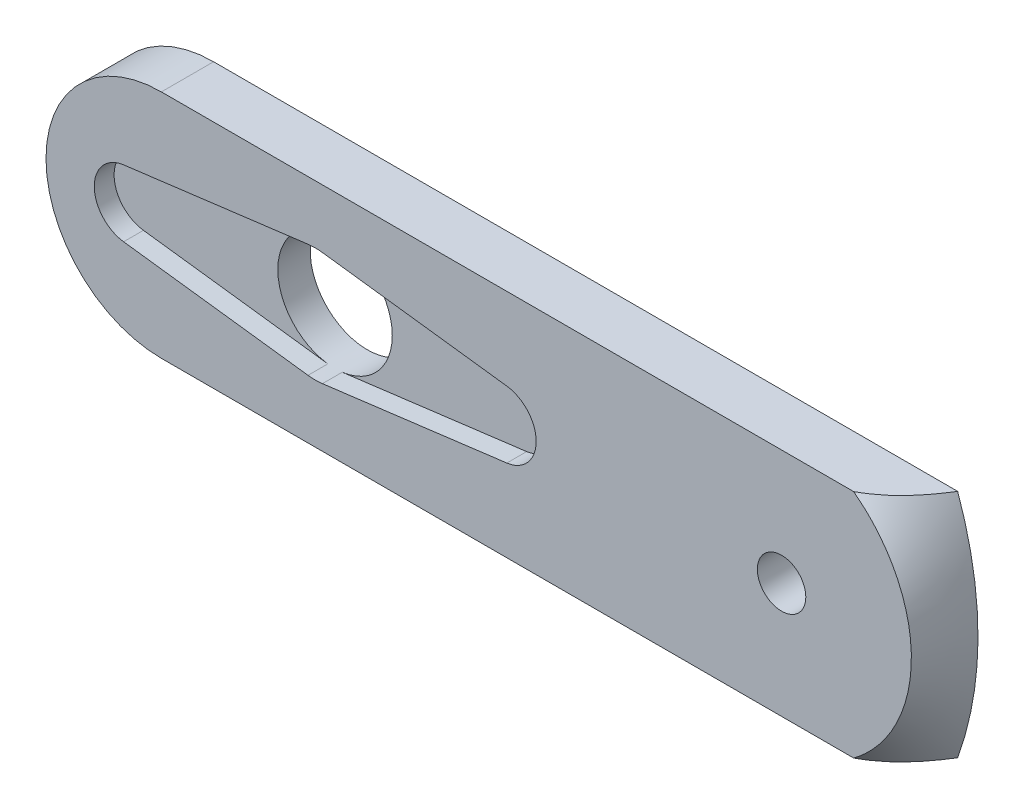
ISO-10303-21;
HEADER;
FILE_DESCRIPTION(('STEP AP214'),'2;1');
FILE_NAME('part.step','',(''),(''),'','','');
FILE_SCHEMA(('AUTOMOTIVE_DESIGN { 1 0 10303 214 1 1 1 1 }'));
ENDSEC;
DATA;
#1=APPLICATION_CONTEXT('core data for automotive mechanical design processes');
#2=APPLICATION_PROTOCOL_DEFINITION('international standard','automotive_design',2000,#1);
#3=PRODUCT_CONTEXT('',#1,'mechanical');
#4=PRODUCT('Part','Part','',(#3));
#5=PRODUCT_RELATED_PRODUCT_CATEGORY('part','',(#4));
#6=PRODUCT_DEFINITION_FORMATION('','',#4);
#7=PRODUCT_DEFINITION_CONTEXT('part definition',#1,'design');
#8=PRODUCT_DEFINITION('design','',#6,#7);
#9=PRODUCT_DEFINITION_SHAPE('','',#8);
#10=(LENGTH_UNIT() NAMED_UNIT(*) SI_UNIT(.MILLI.,.METRE.));
#11=(NAMED_UNIT(*) PLANE_ANGLE_UNIT() SI_UNIT($,.RADIAN.));
#12=(NAMED_UNIT(*) SI_UNIT($,.STERADIAN.) SOLID_ANGLE_UNIT());
#13=UNCERTAINTY_MEASURE_WITH_UNIT(LENGTH_MEASURE(1.E-05),#10,'distance_accuracy_value','');
#14=(GEOMETRIC_REPRESENTATION_CONTEXT(3) GLOBAL_UNCERTAINTY_ASSIGNED_CONTEXT((#13)) GLOBAL_UNIT_ASSIGNED_CONTEXT((#10,
#11,#12)) REPRESENTATION_CONTEXT('',''));
#15=CARTESIAN_POINT('',(0.,0.,0.));
#16=DIRECTION('',(0.,0.,1.));
#17=DIRECTION('',(1.,0.,0.));
#18=AXIS2_PLACEMENT_3D('',#15,#16,#17);
#19=CARTESIAN_POINT('',(-15.875,36.275,12.915050116));
#20=DIRECTION('',(0.,1.,0.));
#21=DIRECTION('',(-1.,0.,0.));
#22=AXIS2_PLACEMENT_3D('',#19,#20,#21);
#23=PLANE('',#22);
#24=CARTESIAN_POINT('',(4.27479089331014,36.275,12.9150501160211));
#25=CARTESIAN_POINT('',(4.18794333084375,36.275,13.0553004026635));
#26=CARTESIAN_POINT('',(4.09939031178845,36.275,13.1945099637529));
#27=CARTESIAN_POINT('',(3.91830719572066,36.275,13.4708936781452));
#28=CARTESIAN_POINT('',(3.82576629708334,36.275,13.6080607474796));
#29=CARTESIAN_POINT('',(3.6364964954175,36.275,13.879795856272));
#30=CARTESIAN_POINT('',(3.5397613652383,36.275,14.0143595701682));
#31=CARTESIAN_POINT('',(3.34187656697785,36.275,14.2803025558375));
#32=CARTESIAN_POINT('',(3.24072492356059,36.275,14.4116803609584));
#33=CARTESIAN_POINT('',(3.03626626662407,36.275,14.6675355060892));
#34=CARTESIAN_POINT('',(2.93307231560844,36.275,14.7921030174213));
#35=CARTESIAN_POINT('',(2.72203957971217,36.275,15.0370948179405));
#36=CARTESIAN_POINT('',(2.61420414651549,36.275,15.1575219875372));
#37=CARTESIAN_POINT('',(2.39368080130622,36.275,15.3936902474856));
#38=CARTESIAN_POINT('',(2.28099654123386,36.275,15.5094347414385));
#39=CARTESIAN_POINT('',(2.0505740421931,36.275,15.7357082233837));
#40=CARTESIAN_POINT('',(1.93283769001432,36.275,15.8462391266568));
#41=CARTESIAN_POINT('',(1.72127304127678,36.275,16.0355114203854));
#42=CARTESIAN_POINT('',(1.62854156515779,36.275,16.1154809673195));
#43=CARTESIAN_POINT('',(1.44009890250969,36.275,16.2718460275529));
#44=CARTESIAN_POINT('',(1.34438755212391,36.275,16.348241343733));
#45=CARTESIAN_POINT('',(1.15003391793479,36.275,16.4971978447037));
#46=CARTESIAN_POINT('',(1.05139181521655,36.275,16.5697592656162));
#47=CARTESIAN_POINT('',(0.849860144381622,36.275,16.7118008009865));
#48=CARTESIAN_POINT('',(0.746930685601863,36.275,16.7812243706619));
#49=CARTESIAN_POINT('',(0.538232373857244,36.275,16.9156959496909));
#50=CARTESIAN_POINT('',(0.432463166342112,36.275,16.9807434090877));
#51=CARTESIAN_POINT('',(0.218214523256502,36.275,17.1063148268337));
#52=CARTESIAN_POINT('',(0.109733985363282,36.275,17.1668369040678));
#53=CARTESIAN_POINT('',(0.,36.275,17.225000094));
#54=B_SPLINE_CURVE_WITH_KNOTS('',3,(#24,#25,#26,#27,#28,#29,#30,#31,#32,#33,#34,#35,#36,#37,#38,
#39,#40,#41,#42,#43,#44,#45,#46,#47,#48,#49,#50,#51,#52,#53),.UNSPECIFIED.,.F.,.F.,(4,2,2,2,2,2,
2,2,2,2,2,2,2,2,4),(0.,0.494895000724621,0.991227030351283,1.48832304174992,1.98564370932828,
2.47081224117761,2.95563611788026,3.44010102611087,3.92438655115526,4.29165885820719,
4.65895139654019,5.02622128763424,5.39857424309917,5.77097390602647,6.14352751760772),.UNSPECIFIED.);
#55=CARTESIAN_POINT('',(4.27479089326775,36.2750000001558,12.915050116));
#56=VERTEX_POINT('',#55);
#57=CARTESIAN_POINT('',(0.,36.275,17.225000094));
#58=VERTEX_POINT('',#57);
#59=EDGE_CURVE('E152',#56,#58,#54,.T.);
#60=ORIENTED_EDGE('',*,*,#59,.F.);
#61=DIRECTION('',(1.,0.,0.));
#62=VECTOR('',#61,1.);
#63=CARTESIAN_POINT('',(-57.15,36.275,12.915050116));
#64=LINE('',#63,#62);
#65=CARTESIAN_POINT('',(-57.15,36.275,12.915050116));
#66=VERTEX_POINT('',#65);
#67=EDGE_CURVE('E142',#66,#56,#64,.T.);
#68=ORIENTED_EDGE('',*,*,#67,.F.);
#69=DIRECTION('',(0.,0.,1.));
#70=VECTOR('',#69,1.);
#71=CARTESIAN_POINT('',(-57.15,36.275,-18.738253535905));
#72=LINE('',#71,#70);
#73=CARTESIAN_POINT('',(-57.15,36.275,17.225000094));
#74=VERTEX_POINT('',#73);
#75=EDGE_CURVE('E229',#66,#74,#72,.T.);
#76=ORIENTED_EDGE('',*,*,#75,.T.);
#77=DIRECTION('',(-1.,0.,0.));
#78=VECTOR('',#77,1.);
#79=CARTESIAN_POINT('',(0.,36.275,17.225000094));
#80=LINE('',#79,#78);
#81=CARTESIAN_POINT('',(-9.52500000000001,36.275,17.225000094));
#82=VERTEX_POINT('',#81);
#83=EDGE_CURVE('E226',#82,#74,#80,.T.);
#84=ORIENTED_EDGE('',*,*,#83,.F.);
#85=CARTESIAN_POINT('',(0.,36.275,17.225000094));
#86=DIRECTION('',(-1.,0.,0.));
#87=VECTOR('',#86,1.);
#88=LINE('',#85,#87);
#89=EDGE_CURVE('E214',#58,#82,#88,.T.);
#90=ORIENTED_EDGE('',*,*,#89,.F.);
#91=EDGE_LOOP('',(#60,#68,#76,#84,#90));
#92=FACE_BOUND('',#91,.T.);
#93=ADVANCED_FACE('F36',(#92),#23,.T.);
#94=CARTESIAN_POINT('',(-57.15,17.225,17.225000094));
#95=DIRECTION('',(0.,-1.,0.));
#96=DIRECTION('',(1.,0.,0.));
#97=AXIS2_PLACEMENT_3D('',#94,#95,#96);
#98=PLANE('',#97);
#99=CARTESIAN_POINT('',(0.,17.225,17.225000094));
#100=CARTESIAN_POINT('',(0.136688693030192,17.225,17.1525621570837));
#101=CARTESIAN_POINT('',(0.271422304674454,17.225,17.0764523098915));
#102=CARTESIAN_POINT('',(0.536369299326438,17.225,16.9174233608304));
#103=CARTESIAN_POINT('',(0.666592786898193,17.225,16.8345210990087));
#104=CARTESIAN_POINT('',(0.922410663568643,17.225,16.6621973888533));
#105=CARTESIAN_POINT('',(1.04801063418056,17.225,16.5727842168717));
#106=CARTESIAN_POINT('',(1.29454050957519,17.225,16.3878212164848));
#107=CARTESIAN_POINT('',(1.41547185860477,17.225,16.2922733106282));
#108=CARTESIAN_POINT('',(1.65036007235586,17.225,16.0973839823706));
#109=CARTESIAN_POINT('',(1.7644059653232,17.225,15.9981496601951));
#110=CARTESIAN_POINT('',(1.98801762157755,17.225,15.794672746648));
#111=CARTESIAN_POINT('',(2.09758150876102,17.225,15.6904280969415));
#112=CARTESIAN_POINT('',(2.3122907176054,17.225,15.4774301008489));
#113=CARTESIAN_POINT('',(2.41743472551892,17.225,15.3686754327394));
#114=CARTESIAN_POINT('',(2.62339356614884,17.225,15.1471823200141));
#115=CARTESIAN_POINT('',(2.72420912703865,17.225,15.0344445513375));
#116=CARTESIAN_POINT('',(2.91228200384608,17.225,14.8163522107272));
#117=CARTESIAN_POINT('',(2.99991476180945,17.225,14.7113205097096));
#118=CARTESIAN_POINT('',(3.17193041769378,17.225,14.4986894905132));
#119=CARTESIAN_POINT('',(3.25631438368281,17.225,14.391091035347));
#120=CARTESIAN_POINT('',(3.42203220915207,17.225,14.173580824842));
#121=CARTESIAN_POINT('',(3.50336618616677,17.225,14.0636691589005));
#122=CARTESIAN_POINT('',(3.66425752967562,17.225,13.8402614866942));
#123=CARTESIAN_POINT('',(3.74377531095845,17.225,13.7267370071403));
#124=CARTESIAN_POINT('',(3.90004503044904,17.225,13.4978029340737));
#125=CARTESIAN_POINT('',(3.97679695488933,17.225,13.3823933311817));
#126=CARTESIAN_POINT('',(4.12769714002857,17.225,13.1499183268782));
#127=CARTESIAN_POINT('',(4.20184595501919,17.225,13.0328532855057));
#128=CARTESIAN_POINT('',(4.27479089919016,17.225,12.9150501160211));
#129=B_SPLINE_CURVE_WITH_KNOTS('',3,(#99,#100,#101,#102,#103,#104,#105,#106,#107,#108,#109,#110,
#111,#112,#113,#114,#115,#116,#117,#118,#119,#120,#121,#122,#123,#124,#125,#126,#127,#128),
.UNSPECIFIED.,.F.,.F.,(4,2,2,2,2,2,2,2,2,2,2,2,2,2,4),(0.,0.464022611801142,0.926927725128426,
1.38925435611067,1.85143680031478,2.30480477624924,2.75836062321493,3.21205034359092,
3.66566343839409,4.07596387073878,4.48612824097206,4.89627678882001,5.31204233094882,
5.7278099423274,6.14348847874914),.UNSPECIFIED.);
#130=CARTESIAN_POINT('',(0.,17.225,17.225000094));
#131=VERTEX_POINT('',#130);
#132=CARTESIAN_POINT('',(4.27479089919015,17.225,12.9150501160211));
#133=VERTEX_POINT('',#132);
#134=EDGE_CURVE('E137',#131,#133,#129,.T.);
#135=ORIENTED_EDGE('',*,*,#134,.F.);
#136=CARTESIAN_POINT('',(-9.52500000000001,17.225,17.225000094));
#137=DIRECTION('',(1.,0.,0.));
#138=VECTOR('',#137,1.);
#139=LINE('',#136,#138);
#140=CARTESIAN_POINT('',(-9.525,17.225,17.225000094));
#141=VERTEX_POINT('',#140);
#142=EDGE_CURVE('E217',#141,#131,#139,.T.);
#143=ORIENTED_EDGE('',*,*,#142,.F.);
#144=DIRECTION('',(1.,0.,0.));
#145=VECTOR('',#144,1.);
#146=CARTESIAN_POINT('',(0.,17.225,17.225000094));
#147=LINE('',#146,#145);
#148=CARTESIAN_POINT('',(-57.15,17.225,17.225000094));
#149=VERTEX_POINT('',#148);
#150=EDGE_CURVE('E219',#149,#141,#147,.T.);
#151=ORIENTED_EDGE('',*,*,#150,.F.);
#152=DIRECTION('',(0.,0.,1.));
#153=VECTOR('',#152,1.);
#154=CARTESIAN_POINT('',(-57.15,17.225,-18.738253535905));
#155=LINE('',#154,#153);
#156=CARTESIAN_POINT('',(-57.15,17.225,12.915050116));
#157=VERTEX_POINT('',#156);
#158=EDGE_CURVE('E140',#157,#149,#155,.T.);
#159=ORIENTED_EDGE('',*,*,#158,.F.);
#160=DIRECTION('',(-1.,0.,0.));
#161=VECTOR('',#160,1.);
#162=CARTESIAN_POINT('',(-57.15,17.225,12.915050116));
#163=LINE('',#162,#161);
#164=EDGE_CURVE('E56',#133,#157,#163,.T.);
#165=ORIENTED_EDGE('',*,*,#164,.F.);
#166=EDGE_LOOP('',(#135,#143,#151,#159,#165));
#167=FACE_BOUND('',#166,.T.);
#168=ADVANCED_FACE('F135',(#167),#98,.T.);
#169=CARTESIAN_POINT('',(-57.15,36.275,12.915050116));
#170=DIRECTION('',(0.,0.,-1.));
#171=DIRECTION('',(-1.,0.,0.));
#172=AXIS2_PLACEMENT_3D('',#169,#170,#171);
#173=PLANE('',#172);
#174=CARTESIAN_POINT('',(-5.95210200823162,26.7500000000779,12.915050116));
#175=DIRECTION('',(0.,0.,-1.));
#176=DIRECTION('',(-1.,0.,0.));
#177=AXIS2_PLACEMENT_3D('',#174,#175,#176);
#178=CIRCLE('',#177,2.);
#179=CARTESIAN_POINT('',(-7.95210200823162,26.7500000000779,12.915050116));
#180=VERTEX_POINT('',#179);
#181=EDGE_CURVE('E215',#180,#180,#178,.T.);
#182=ORIENTED_EDGE('',*,*,#181,.F.);
#183=EDGE_LOOP('',(#182));
#184=FACE_BOUND('',#183,.T.);
#185=CARTESIAN_POINT('',(4.27479089916163,17.2249999998832,12.915050116));
#186=CARTESIAN_POINT('',(4.41299990993948,17.6131200922984,12.915050116));
#187=CARTESIAN_POINT('',(4.54349401651454,18.0040180417642,12.915050116));
#188=CARTESIAN_POINT('',(4.78828214226387,18.7909023622219,12.915050116));
#189=CARTESIAN_POINT('',(4.9025741659085,19.1868893534662,12.915050116));
#190=CARTESIAN_POINT('',(5.11420616796396,19.9835871683499,12.915050116));
#191=CARTESIAN_POINT('',(5.21153766941409,20.3843002478996,12.915050116));
#192=CARTESIAN_POINT('',(5.38889062892549,21.1895216789333,12.915050116));
#193=CARTESIAN_POINT('',(5.46891290846686,21.5940298493546,12.915050116));
#194=CARTESIAN_POINT('',(5.60896167204657,22.3941688354375,12.915050116));
#195=CARTESIAN_POINT('',(5.66950972119727,22.7897082025009,12.915050116));
#196=CARTESIAN_POINT('',(5.77325398085823,23.583062996087,12.915050116));
#197=CARTESIAN_POINT('',(5.8164499535445,23.9808784537296,12.915050116));
#198=CARTESIAN_POINT('',(5.88558987024871,24.777876232266,12.915050116));
#199=CARTESIAN_POINT('',(5.91153928091858,25.1770580796906,12.915050116));
#200=CARTESIAN_POINT('',(5.94600376428673,25.9761744854712,12.915050116));
#201=CARTESIAN_POINT('',(5.95451907710353,26.3761090333843,12.915050116));
#202=CARTESIAN_POINT('',(5.95375375953051,27.1738579032581,12.915050116));
#203=CARTESIAN_POINT('',(5.94456644656798,27.5716723186967,12.915050116));
#204=CARTESIAN_POINT('',(5.90895706983451,28.366527783349,12.915050116));
#205=CARTESIAN_POINT('',(5.88253480746004,28.7635688235981,12.915050116));
#206=CARTESIAN_POINT('',(5.81262934974388,29.5562716731528,12.915050116));
#207=CARTESIAN_POINT('',(5.76914091089193,29.9519330208238,12.915050116));
#208=CARTESIAN_POINT('',(5.66499579758311,30.7409829032863,12.915050116));
#209=CARTESIAN_POINT('',(5.6043393429044,31.1343714671072,12.915050116));
#210=CARTESIAN_POINT('',(5.46427806168487,31.9300983707612,12.915050116));
#211=CARTESIAN_POINT('',(5.38436040775598,32.3323462878501,12.915050116));
#212=CARTESIAN_POINT('',(5.20740938111902,33.1330767189629,12.915050116));
#213=CARTESIAN_POINT('',(5.11037521527569,33.5315590575977,12.915050116));
#214=CARTESIAN_POINT('',(4.89952585959028,34.323841929247,12.915050116));
#215=CARTESIAN_POINT('',(4.78571890769332,34.7176446586224,12.915050116));
#216=CARTESIAN_POINT('',(4.54208018950583,35.5002135159143,12.915050116));
#217=CARTESIAN_POINT('',(4.41225035821075,35.8889802457476,12.915050116));
#218=CARTESIAN_POINT('',(4.27479089326775,36.2750000001558,12.915050116));
#219=B_SPLINE_CURVE_WITH_KNOTS('',3,(#185,#186,#187,#188,#189,#190,#191,#192,#193,#194,#195,
#196,#197,#198,#199,#200,#201,#202,#203,#204,#205,#206,#207,#208,#209,#210,#211,#212,#213,#214,
#215,#216,#217,#218),.UNSPECIFIED.,.F.,.F.,(4,2,2,2,2,2,2,2,2,2,2,2,2,2,2,2,4),(0.,
1.23594388129098,2.47203985560594,3.7087518763194,4.94540519090868,6.14546962283999,
7.34555050204564,8.5452508093305,9.74493459312245,10.9383116742609,12.1317025072884,
13.3254602920169,14.5192027954197,15.7491505331369,16.9791552784549,18.2085579084991,
19.4378122153299),.UNSPECIFIED.);
#220=EDGE_CURVE('E145',#133,#56,#219,.T.);
#221=ORIENTED_EDGE('',*,*,#220,.F.);
#222=ORIENTED_EDGE('',*,*,#164,.T.);
#223=CARTESIAN_POINT('',(-57.15,26.75,12.915050116));
#224=DIRECTION('',(0.,0.,-1.));
#225=DIRECTION('',(1.,0.,0.));
#226=AXIS2_PLACEMENT_3D('',#223,#224,#225);
#227=CIRCLE('',#226,9.525);
#228=EDGE_CURVE('E157',#157,#66,#227,.T.);
#229=ORIENTED_EDGE('',*,*,#228,.T.);
#230=ORIENTED_EDGE('',*,*,#67,.T.);
#231=EDGE_LOOP('',(#221,#222,#229,#230));
#232=FACE_BOUND('',#231,.T.);
#233=CARTESIAN_POINT('',(-44.45,26.75,12.915050116));
#234=DIRECTION('',(0.,0.,1.));
#235=DIRECTION('',(1.,0.,0.));
#236=AXIS2_PLACEMENT_3D('',#233,#234,#235);
#237=CIRCLE('',#236,4.723765);
#238=CARTESIAN_POINT('',(-39.726235,26.75,12.915050116));
#239=VERTEX_POINT('',#238);
#240=EDGE_CURVE('E141',#239,#239,#237,.F.);
#241=ORIENTED_EDGE('',*,*,#240,.F.);
#242=EDGE_LOOP('',(#241));
#243=FACE_BOUND('',#242,.T.);
#244=ADVANCED_FACE('F146',(#184,#232,#243),#173,.T.);
#245=CARTESIAN_POINT('',(-44.45,26.75,17.225000094));
#246=DIRECTION('',(0.,0.,-1.));
#247=DIRECTION('',(-1.,0.,0.));
#248=AXIS2_PLACEMENT_3D('',#245,#246,#247);
#249=PLANE('',#248);
#250=CARTESIAN_POINT('',(-5.95210200823162,26.7500000000779,17.225000094));
#251=DIRECTION('',(0.,0.,1.));
#252=DIRECTION('',(1.,0.,0.));
#253=AXIS2_PLACEMENT_3D('',#250,#251,#252);
#254=CIRCLE('',#253,2.);
#255=CARTESIAN_POINT('',(-3.95210200823162,26.7500000000779,17.225000094));
#256=VERTEX_POINT('',#255);
#257=EDGE_CURVE('E321',#256,#256,#254,.T.);
#258=ORIENTED_EDGE('',*,*,#257,.F.);
#259=EDGE_LOOP('',(#258));
#260=FACE_BOUND('',#259,.T.);
#261=DIRECTION('',(0.992003089277266,-0.126213592233009,0.));
#262=VECTOR('',#261,1.);
#263=CARTESIAN_POINT('',(-43.8537966504854,31.4359894730198,17.225000094));
#264=LINE('',#263,#262);
#265=CARTESIAN_POINT('',(-43.8537966504854,31.4359894730198,17.225000094));
#266=VERTEX_POINT('',#265);
#267=CARTESIAN_POINT('',(-28.6319218932039,29.4992944018007,17.225000094));
#268=VERTEX_POINT('',#267);
#269=EDGE_CURVE('E48',#266,#268,#264,.T.);
#270=ORIENTED_EDGE('',*,*,#269,.T.);
#271=CARTESIAN_POINT('',(-28.9817175,26.75,17.225000094));
#272=DIRECTION('',(0.,0.,-1.));
#273=DIRECTION('',(-1.,0.,0.));
#274=AXIS2_PLACEMENT_3D('',#271,#272,#273);
#275=CIRCLE('',#274,2.7714575);
#276=CARTESIAN_POINT('',(-28.6319218932039,24.0007055981994,17.225000094));
#277=VERTEX_POINT('',#276);
#278=EDGE_CURVE('E11',#268,#277,#275,.T.);
#279=ORIENTED_EDGE('',*,*,#278,.T.);
#280=DIRECTION('',(-0.992003089277266,-0.126213592233011,0.));
#281=VECTOR('',#280,1.);
#282=CARTESIAN_POINT('',(-43.8537966504854,22.0640105269802,17.225000094));
#283=LINE('',#282,#281);
#284=CARTESIAN_POINT('',(-43.8537966504854,22.0640105269802,17.225000094));
#285=VERTEX_POINT('',#284);
#286=EDGE_CURVE('E298',#277,#285,#283,.T.);
#287=ORIENTED_EDGE('',*,*,#286,.T.);
#288=CARTESIAN_POINT('',(-44.45,26.75,17.225000094));
#289=DIRECTION('',(0.,0.,-1.));
#290=DIRECTION('',(-1.,0.,0.));
#291=AXIS2_PLACEMENT_3D('',#288,#289,#290);
#292=CIRCLE('',#291,4.723765);
#293=CARTESIAN_POINT('',(-45.0462033495146,22.0640105269802,17.225000094));
#294=VERTEX_POINT('',#293);
#295=EDGE_CURVE('E292',#285,#294,#292,.T.);
#296=ORIENTED_EDGE('',*,*,#295,.T.);
#297=DIRECTION('',(-0.992003089277266,0.126213592233009,0.));
#298=VECTOR('',#297,1.);
#299=CARTESIAN_POINT('',(-45.0462033495146,22.0640105269802,17.225000094));
#300=LINE('',#299,#298);
#301=CARTESIAN_POINT('',(-60.2680781067961,24.0007055981993,17.225000094));
#302=VERTEX_POINT('',#301);
#303=EDGE_CURVE('E376',#294,#302,#300,.T.);
#304=ORIENTED_EDGE('',*,*,#303,.T.);
#305=CARTESIAN_POINT('',(-59.9182825,26.75,17.225000094));
#306=DIRECTION('',(0.,0.,-1.));
#307=DIRECTION('',(-1.,0.,0.));
#308=AXIS2_PLACEMENT_3D('',#305,#306,#307);
#309=CIRCLE('',#308,2.7714575);
#310=CARTESIAN_POINT('',(-60.2680781067961,29.4992944018006,17.225000094));
#311=VERTEX_POINT('',#310);
#312=EDGE_CURVE('E378',#302,#311,#309,.T.);
#313=ORIENTED_EDGE('',*,*,#312,.T.);
#314=DIRECTION('',(0.992003089277266,0.126213592233011,0.));
#315=VECTOR('',#314,1.);
#316=CARTESIAN_POINT('',(-45.0462033495146,31.4359894730198,17.225000094));
#317=LINE('',#316,#315);
#318=CARTESIAN_POINT('',(-45.0462033495146,31.4359894730198,17.225000094));
#319=VERTEX_POINT('',#318);
#320=EDGE_CURVE('E305',#311,#319,#317,.T.);
#321=ORIENTED_EDGE('',*,*,#320,.T.);
#322=EDGE_CURVE('E303',#319,#266,#292,.T.);
#323=ORIENTED_EDGE('',*,*,#322,.T.);
#324=EDGE_LOOP('',(#270,#279,#287,#296,#304,#313,#321,#323));
#325=FACE_BOUND('',#324,.T.);
#326=ORIENTED_EDGE('',*,*,#89,.T.);
#327=ORIENTED_EDGE('',*,*,#83,.T.);
#328=CARTESIAN_POINT('',(-57.15,26.75,17.225000094));
#329=DIRECTION('',(0.,0.,1.));
#330=DIRECTION('',(-1.,0.,0.));
#331=AXIS2_PLACEMENT_3D('',#328,#329,#330);
#332=CIRCLE('',#331,9.525);
#333=EDGE_CURVE('E223',#74,#149,#332,.T.);
#334=ORIENTED_EDGE('',*,*,#333,.T.);
#335=ORIENTED_EDGE('',*,*,#150,.T.);
#336=ORIENTED_EDGE('',*,*,#142,.T.);
#337=CARTESIAN_POINT('',(0.,36.275,17.225000094));
#338=CARTESIAN_POINT('',(0.635000000000002,35.79875,17.225000094));
#339=CARTESIAN_POINT('',(1.25474760743104,35.2341433664853,17.225000094));
#340=CARTESIAN_POINT('',(2.39867705010322,33.9233908800901,17.225000094));
#341=CARTESIAN_POINT('',(2.92231833910035,33.1769031141868,17.225000094));
#342=CARTESIAN_POINT('',(3.80121107266437,31.5289792387543,17.225000094));
#343=CARTESIAN_POINT('',(4.15568047337279,30.6276331360947,17.225000094));
#344=CARTESIAN_POINT('',(4.63662721893492,28.7339053254438,17.225000094));
#345=CARTESIAN_POINT('',(4.76250000000001,27.7421875,17.225000094));
#346=CARTESIAN_POINT('',(4.76250000000001,25.7578125,17.225000094));
#347=CARTESIAN_POINT('',(4.63662721893492,24.7660946745562,17.225000094));
#348=CARTESIAN_POINT('',(4.15568047337279,22.8723668639053,17.225000094));
#349=CARTESIAN_POINT('',(3.80121107266437,21.9710207612457,17.225000094));
#350=CARTESIAN_POINT('',(2.92231833910035,20.3230968858132,17.225000094));
#351=CARTESIAN_POINT('',(2.39867705010321,19.5766091199099,17.225000094));
#352=CARTESIAN_POINT('',(1.25474760743104,18.2658566335147,17.225000094));
#353=CARTESIAN_POINT('',(0.634999999999999,17.70125,17.225000094));
#354=CARTESIAN_POINT('',(0.,17.225,17.225000094));
#355=B_SPLINE_CURVE_WITH_KNOTS('',3,(#337,#338,#339,#340,#341,#342,#343,#344,#345,#346,#347,
#348,#349,#350,#351,#352,#353,#354),.UNSPECIFIED.,.F.,.F.,(4,2,2,2,2,2,2,2,4),(0.,0.125,0.25,
0.375,0.5,0.625,0.75,0.875,1.),.UNSPECIFIED.);
#356=EDGE_CURVE('E155',#131,#58,#355,.F.);
#357=ORIENTED_EDGE('',*,*,#356,.T.);
#358=EDGE_LOOP('',(#326,#327,#334,#335,#336,#357));
#359=FACE_BOUND('',#358,.T.);
#360=ADVANCED_FACE('F187',(#260,#325,#359),#249,.F.);
#361=CARTESIAN_POINT('',(9.52500000000001,0.,0.));
#362=CARTESIAN_POINT('',(0.,17.225,17.225000094));
#363=CARTESIAN_POINT('',(9.52500000000001,2.22916666391668,0.));
#364=CARTESIAN_POINT('',(0.634999999999999,17.70125,17.225000094));
#365=CARTESIAN_POINT('',(9.52500000000001,4.45833332783335,0.));
#366=CARTESIAN_POINT('',(1.25474760743104,18.2658566335147,17.225000094));
#367=CARTESIAN_POINT('',(9.52500000000001,8.9166666556667,0.));
#368=CARTESIAN_POINT('',(2.39867705010321,19.5766091199099,17.225000094));
#369=CARTESIAN_POINT('',(9.52500000000001,11.1458333195834,0.));
#370=CARTESIAN_POINT('',(2.92231833910035,20.3230968858132,17.225000094));
#371=CARTESIAN_POINT('',(9.52500000000001,15.6041666474167,0.));
#372=CARTESIAN_POINT('',(3.80121107266437,21.9710207612457,17.225000094));
#373=CARTESIAN_POINT('',(9.52500000000001,17.8333333113334,0.));
#374=CARTESIAN_POINT('',(4.15568047337279,22.8723668639053,17.225000094));
#375=CARTESIAN_POINT('',(9.52500000000001,22.2916666391667,0.));
#376=CARTESIAN_POINT('',(4.63662721893492,24.7660946745562,17.225000094));
#377=CARTESIAN_POINT('',(9.52500000000001,24.5208333030834,0.));
#378=CARTESIAN_POINT('',(4.76250000000001,25.7578125,17.225000094));
#379=CARTESIAN_POINT('',(9.52500000000001,28.9791666309167,0.));
#380=CARTESIAN_POINT('',(4.76250000000001,27.7421875,17.225000094));
#381=CARTESIAN_POINT('',(9.52500000000001,31.2083332948334,0.));
#382=CARTESIAN_POINT('',(4.63662721893492,28.7339053254438,17.225000094));
#383=CARTESIAN_POINT('',(9.52500000000001,35.6666666226667,0.));
#384=CARTESIAN_POINT('',(4.15568047337279,30.6276331360947,17.225000094));
#385=CARTESIAN_POINT('',(9.52500000000001,37.8958332865834,0.));
#386=CARTESIAN_POINT('',(3.80121107266437,31.5289792387543,17.225000094));
#387=CARTESIAN_POINT('',(9.52500000000001,42.3541666144167,0.));
#388=CARTESIAN_POINT('',(2.92231833910035,33.1769031141868,17.225000094));
#389=CARTESIAN_POINT('',(9.52500000000001,44.5833332783334,0.));
#390=CARTESIAN_POINT('',(2.39867705010322,33.9233908800901,17.225000094));
#391=CARTESIAN_POINT('',(9.52500000000001,49.0416666061667,0.));
#392=CARTESIAN_POINT('',(1.25474760743104,35.2341433664853,17.225000094));
#393=CARTESIAN_POINT('',(9.52500000000001,51.2708332700833,0.));
#394=CARTESIAN_POINT('',(0.635000000000002,35.79875,17.225000094));
#395=CARTESIAN_POINT('',(9.52500000000001,53.499999934,0.));
#396=CARTESIAN_POINT('',(0.,36.275,17.225000094));
#397=B_SPLINE_SURFACE_WITH_KNOTS('',3,1,((#361,#362),(#363,#364),(#365,#366),(#367,#368),(#369,
#370),(#371,#372),(#373,#374),(#375,#376),(#377,#378),(#379,#380),(#381,#382),(#383,#384),(#385,
#386),(#387,#388),(#389,#390),(#391,#392),(#393,#394),(#395,#396)),.UNSPECIFIED.,.F.,.F.,.F.,(4,
2,2,2,2,2,2,2,4),(2,2),(0.,0.125,0.25,0.375,0.5,0.625,0.75,0.875,1.),(0.,1.),.UNSPECIFIED.);
#398=ORIENTED_EDGE('',*,*,#220,.T.);
#399=ORIENTED_EDGE('',*,*,#59,.T.);
#400=ORIENTED_EDGE('',*,*,#356,.F.);
#401=ORIENTED_EDGE('',*,*,#134,.T.);
#402=EDGE_LOOP('',(#398,#399,#400,#401));
#403=FACE_BOUND('',#402,.T.);
#404=ADVANCED_FACE('F38',(#403),#397,.T.);
#405=CARTESIAN_POINT('',(-57.15,26.75,-18.738253535905));
#406=DIRECTION('',(0.,0.,1.));
#407=DIRECTION('',(1.,0.,0.));
#408=AXIS2_PLACEMENT_3D('',#405,#406,#407);
#409=CYLINDRICAL_SURFACE('',#408,9.525);
#410=ORIENTED_EDGE('',*,*,#228,.F.);
#411=ORIENTED_EDGE('',*,*,#158,.T.);
#412=ORIENTED_EDGE('',*,*,#333,.F.);
#413=ORIENTED_EDGE('',*,*,#75,.F.);
#414=EDGE_LOOP('',(#410,#411,#412,#413));
#415=FACE_BOUND('',#414,.T.);
#416=ADVANCED_FACE('F342',(#415),#409,.T.);
#417=CARTESIAN_POINT('',(-28.9817175,26.75,17.7190628706615));
#418=DIRECTION('',(0.,0.,-1.));
#419=DIRECTION('',(0.126213592233011,-0.992003089277266,0.));
#420=AXIS2_PLACEMENT_3D('',#417,#418,#419);
#421=CYLINDRICAL_SURFACE('',#420,2.7714575);
#422=DIRECTION('',(0.,0.,-1.));
#423=VECTOR('',#422,1.);
#424=CARTESIAN_POINT('',(-28.6319218932039,24.0007055981994,17.7190628706615));
#425=LINE('',#424,#423);
#426=CARTESIAN_POINT('',(-28.6319218932039,24.0007055981994,15.5892728706615));
#427=VERTEX_POINT('',#426);
#428=EDGE_CURVE('E252',#277,#427,#425,.T.);
#429=ORIENTED_EDGE('',*,*,#428,.F.);
#430=ORIENTED_EDGE('',*,*,#278,.F.);
#431=DIRECTION('',(0.,0.,-1.));
#432=VECTOR('',#431,1.);
#433=CARTESIAN_POINT('',(-28.6319218932039,29.4992944018007,17.7190628706615));
#434=LINE('',#433,#432);
#435=CARTESIAN_POINT('',(-28.6319218932039,29.4992944018007,15.5892728706615));
#436=VERTEX_POINT('',#435);
#437=EDGE_CURVE('E271',#268,#436,#434,.T.);
#438=ORIENTED_EDGE('',*,*,#437,.T.);
#439=CARTESIAN_POINT('',(-28.9817175,26.75,15.5892728706615));
#440=DIRECTION('',(0.,0.,-1.));
#441=DIRECTION('',(0.126213592233011,-0.992003089277266,0.));
#442=AXIS2_PLACEMENT_3D('',#439,#440,#441);
#443=CIRCLE('',#442,2.7714575);
#444=EDGE_CURVE('E260',#436,#427,#443,.T.);
#445=ORIENTED_EDGE('',*,*,#444,.T.);
#446=EDGE_LOOP('',(#429,#430,#438,#445));
#447=FACE_BOUND('',#446,.T.);
#448=ADVANCED_FACE('F300',(#447),#421,.F.);
#449=CARTESIAN_POINT('',(-59.9182825,26.75,17.7190628706615));
#450=DIRECTION('',(0.,0.,-1.));
#451=DIRECTION('',(-0.126213592233011,0.992003089277266,0.));
#452=AXIS2_PLACEMENT_3D('',#449,#450,#451);
#453=CYLINDRICAL_SURFACE('',#452,2.7714575);
#454=DIRECTION('',(0.,0.,-1.));
#455=VECTOR('',#454,1.);
#456=CARTESIAN_POINT('',(-60.2680781067961,29.4992944018006,17.7190628706615));
#457=LINE('',#456,#455);
#458=CARTESIAN_POINT('',(-60.2680781067961,29.4992944018006,15.5892728706615));
#459=VERTEX_POINT('',#458);
#460=EDGE_CURVE('E256',#311,#459,#457,.T.);
#461=ORIENTED_EDGE('',*,*,#460,.F.);
#462=ORIENTED_EDGE('',*,*,#312,.F.);
#463=DIRECTION('',(0.,0.,-1.));
#464=VECTOR('',#463,1.);
#465=CARTESIAN_POINT('',(-60.2680781067961,24.0007055981993,17.7190628706615));
#466=LINE('',#465,#464);
#467=CARTESIAN_POINT('',(-60.2680781067961,24.0007055981993,15.5892728706615));
#468=VERTEX_POINT('',#467);
#469=EDGE_CURVE('E251',#302,#468,#466,.T.);
#470=ORIENTED_EDGE('',*,*,#469,.T.);
#471=CARTESIAN_POINT('',(-59.9182825,26.75,15.5892728706615));
#472=DIRECTION('',(0.,0.,-1.));
#473=DIRECTION('',(-0.126213592233011,0.992003089277266,0.));
#474=AXIS2_PLACEMENT_3D('',#471,#472,#473);
#475=CIRCLE('',#474,2.7714575);
#476=EDGE_CURVE('E244',#468,#459,#475,.T.);
#477=ORIENTED_EDGE('',*,*,#476,.T.);
#478=EDGE_LOOP('',(#461,#462,#470,#477));
#479=FACE_BOUND('',#478,.T.);
#480=ADVANCED_FACE('F335',(#479),#453,.F.);
#481=CARTESIAN_POINT('',(-43.8537966504854,31.4359894730198,17.7190628706615));
#482=DIRECTION('',(0.126213592233009,0.992003089277266,0.));
#483=DIRECTION('',(0.,0.,1.));
#484=AXIS2_PLACEMENT_3D('',#481,#482,#483);
#485=PLANE('',#484);
#486=DIRECTION('',(0.,0.,-1.));
#487=VECTOR('',#486,1.);
#488=CARTESIAN_POINT('',(-43.8537966504854,31.4359894730198,16.1080678706615));
#489=LINE('',#488,#487);
#490=CARTESIAN_POINT('',(-43.8537966504854,31.4359894730198,15.5892728706615));
#491=VERTEX_POINT('',#490);
#492=EDGE_CURVE('E243',#266,#491,#489,.T.);
#493=ORIENTED_EDGE('',*,*,#492,.T.);
#494=DIRECTION('',(0.992003089277266,-0.126213592233009,0.));
#495=VECTOR('',#494,1.);
#496=CARTESIAN_POINT('',(-28.6319218932039,29.4992944018007,15.5892728706615));
#497=LINE('',#496,#495);
#498=EDGE_CURVE('E262',#491,#436,#497,.T.);
#499=ORIENTED_EDGE('',*,*,#498,.T.);
#500=ORIENTED_EDGE('',*,*,#437,.F.);
#501=ORIENTED_EDGE('',*,*,#269,.F.);
#502=EDGE_LOOP('',(#493,#499,#500,#501));
#503=FACE_BOUND('',#502,.T.);
#504=ADVANCED_FACE('F281',(#503),#485,.F.);
#505=CARTESIAN_POINT('',(-44.45,26.75,15.5892728706615));
#506=DIRECTION('',(0.,0.,1.));
#507=DIRECTION('',(0.,-1.,0.));
#508=AXIS2_PLACEMENT_3D('',#505,#506,#507);
#509=PLANE('',#508);
#510=DIRECTION('',(-0.992003089277266,-0.126213592233011,0.));
#511=VECTOR('',#510,1.);
#512=CARTESIAN_POINT('',(-43.8537966504854,22.0640105269802,15.5892728706615));
#513=LINE('',#512,#511);
#514=CARTESIAN_POINT('',(-43.8537966504854,22.0640105269802,15.5892728706615));
#515=VERTEX_POINT('',#514);
#516=EDGE_CURVE('E242',#427,#515,#513,.T.);
#517=ORIENTED_EDGE('',*,*,#516,.F.);
#518=ORIENTED_EDGE('',*,*,#444,.F.);
#519=ORIENTED_EDGE('',*,*,#498,.F.);
#520=CARTESIAN_POINT('',(-44.45,26.75,15.5892728706615));
#521=DIRECTION('',(0.,0.,-1.));
#522=DIRECTION('',(1.,0.,0.));
#523=AXIS2_PLACEMENT_3D('',#520,#521,#522);
#524=CIRCLE('',#523,4.723765);
#525=EDGE_CURVE('E263',#491,#515,#524,.T.);
#526=ORIENTED_EDGE('',*,*,#525,.T.);
#527=EDGE_LOOP('',(#517,#518,#519,#526));
#528=FACE_BOUND('',#527,.T.);
#529=ADVANCED_FACE('F289',(#528),#509,.T.);
#530=CARTESIAN_POINT('',(-28.6319218932039,24.0007055981994,17.7190628706615));
#531=DIRECTION('',(0.126213592233011,-0.992003089277266,0.));
#532=DIRECTION('',(0.,0.,1.));
#533=AXIS2_PLACEMENT_3D('',#530,#531,#532);
#534=PLANE('',#533);
#535=ORIENTED_EDGE('',*,*,#428,.T.);
#536=ORIENTED_EDGE('',*,*,#516,.T.);
#537=DIRECTION('',(0.,0.,-1.));
#538=VECTOR('',#537,1.);
#539=CARTESIAN_POINT('',(-43.8537966504854,22.0640105269802,16.1080678706615));
#540=LINE('',#539,#538);
#541=EDGE_CURVE('E248',#285,#515,#540,.T.);
#542=ORIENTED_EDGE('',*,*,#541,.F.);
#543=ORIENTED_EDGE('',*,*,#286,.F.);
#544=EDGE_LOOP('',(#535,#536,#542,#543));
#545=FACE_BOUND('',#544,.T.);
#546=ADVANCED_FACE('F296',(#545),#534,.F.);
#547=CARTESIAN_POINT('',(-45.0462033495145,22.0640105269802,17.7190628706615));
#548=DIRECTION('',(-0.126213592233009,-0.992003089277266,0.));
#549=DIRECTION('',(-0.992003089277266,0.126213592233009,0.));
#550=AXIS2_PLACEMENT_3D('',#547,#548,#549);
#551=PLANE('',#550);
#552=DIRECTION('',(0.,0.,-1.));
#553=VECTOR('',#552,1.);
#554=CARTESIAN_POINT('',(-45.0462033495146,22.0640105269802,16.1080678706615));
#555=LINE('',#554,#553);
#556=CARTESIAN_POINT('',(-45.0462033495146,22.0640105269802,15.5892728706615));
#557=VERTEX_POINT('',#556);
#558=EDGE_CURVE('E64',#294,#557,#555,.T.);
#559=ORIENTED_EDGE('',*,*,#558,.T.);
#560=DIRECTION('',(-0.992003089277266,0.126213592233009,0.));
#561=VECTOR('',#560,1.);
#562=CARTESIAN_POINT('',(-60.2680781067961,24.0007055981993,15.5892728706615));
#563=LINE('',#562,#561);
#564=EDGE_CURVE('E246',#557,#468,#563,.T.);
#565=ORIENTED_EDGE('',*,*,#564,.T.);
#566=ORIENTED_EDGE('',*,*,#469,.F.);
#567=ORIENTED_EDGE('',*,*,#303,.F.);
#568=EDGE_LOOP('',(#559,#565,#566,#567));
#569=FACE_BOUND('',#568,.T.);
#570=ADVANCED_FACE('F347',(#569),#551,.F.);
#571=CARTESIAN_POINT('',(-44.45,26.75,15.5892728706615));
#572=DIRECTION('',(0.,0.,1.));
#573=DIRECTION('',(0.,-1.,0.));
#574=AXIS2_PLACEMENT_3D('',#571,#572,#573);
#575=PLANE('',#574);
#576=CARTESIAN_POINT('',(-44.45,26.75,15.5892728706615));
#577=DIRECTION('',(0.,0.,-1.));
#578=DIRECTION('',(1.,0.,0.));
#579=AXIS2_PLACEMENT_3D('',#576,#577,#578);
#580=CIRCLE('',#579,4.723765);
#581=CARTESIAN_POINT('',(-45.0462033495146,31.4359894730198,15.5892728706615));
#582=VERTEX_POINT('',#581);
#583=EDGE_CURVE('E240',#557,#582,#580,.T.);
#584=ORIENTED_EDGE('',*,*,#583,.T.);
#585=DIRECTION('',(0.992003089277266,0.126213592233011,0.));
#586=VECTOR('',#585,1.);
#587=CARTESIAN_POINT('',(-45.0462033495146,31.4359894730198,15.5892728706615));
#588=LINE('',#587,#586);
#589=EDGE_CURVE('E247',#459,#582,#588,.T.);
#590=ORIENTED_EDGE('',*,*,#589,.F.);
#591=ORIENTED_EDGE('',*,*,#476,.F.);
#592=ORIENTED_EDGE('',*,*,#564,.F.);
#593=EDGE_LOOP('',(#584,#590,#591,#592));
#594=FACE_BOUND('',#593,.T.);
#595=ADVANCED_FACE('F338',(#594),#575,.T.);
#596=CARTESIAN_POINT('',(-60.2680781067961,29.4992944018006,17.7190628706615));
#597=DIRECTION('',(-0.126213592233011,0.992003089277266,0.));
#598=DIRECTION('',(0.,0.,-1.));
#599=AXIS2_PLACEMENT_3D('',#596,#597,#598);
#600=PLANE('',#599);
#601=ORIENTED_EDGE('',*,*,#460,.T.);
#602=ORIENTED_EDGE('',*,*,#589,.T.);
#603=DIRECTION('',(0.,0.,-1.));
#604=VECTOR('',#603,1.);
#605=CARTESIAN_POINT('',(-45.0462033495146,31.4359894730198,16.1080678706615));
#606=LINE('',#605,#604);
#607=EDGE_CURVE('E255',#319,#582,#606,.T.);
#608=ORIENTED_EDGE('',*,*,#607,.F.);
#609=ORIENTED_EDGE('',*,*,#320,.F.);
#610=EDGE_LOOP('',(#601,#602,#608,#609));
#611=FACE_BOUND('',#610,.T.);
#612=ADVANCED_FACE('F330',(#611),#600,.F.);
#613=CARTESIAN_POINT('',(-44.45,26.75,16.1080678706615));
#614=DIRECTION('',(0.,0.,-1.));
#615=DIRECTION('',(1.,0.,0.));
#616=AXIS2_PLACEMENT_3D('',#613,#614,#615);
#617=CYLINDRICAL_SURFACE('',#616,4.723765);
#618=ORIENTED_EDGE('',*,*,#240,.T.);
#619=EDGE_LOOP('',(#618));
#620=FACE_BOUND('',#619,.T.);
#621=ORIENTED_EDGE('',*,*,#607,.T.);
#622=ORIENTED_EDGE('',*,*,#583,.F.);
#623=ORIENTED_EDGE('',*,*,#558,.F.);
#624=ORIENTED_EDGE('',*,*,#295,.F.);
#625=ORIENTED_EDGE('',*,*,#541,.T.);
#626=ORIENTED_EDGE('',*,*,#525,.F.);
#627=ORIENTED_EDGE('',*,*,#492,.F.);
#628=ORIENTED_EDGE('',*,*,#322,.F.);
#629=EDGE_LOOP('',(#621,#622,#623,#624,#625,#626,#627,#628));
#630=FACE_BOUND('',#629,.T.);
#631=ADVANCED_FACE('F194',(#620,#630),#617,.F.);
#632=CARTESIAN_POINT('',(-5.95210200823162,26.7500000000779,12.915025116));
#633=DIRECTION('',(0.,0.,1.));
#634=DIRECTION('',(1.,0.,0.));
#635=AXIS2_PLACEMENT_3D('',#632,#633,#634);
#636=CYLINDRICAL_SURFACE('',#635,2.);
#637=ORIENTED_EDGE('',*,*,#181,.T.);
#638=EDGE_LOOP('',(#637));
#639=FACE_BOUND('',#638,.T.);
#640=ORIENTED_EDGE('',*,*,#257,.T.);
#641=EDGE_LOOP('',(#640));
#642=FACE_BOUND('',#641,.T.);
#643=ADVANCED_FACE('F186',(#639,#642),#636,.F.);
#644=CLOSED_SHELL('',(#93,#168,#244,#360,#404,#416,#448,#480,#504,#529,#546,#570,#595,#612,#631,#643));
#645=MANIFOLD_SOLID_BREP('B2',#644);
#646=ADVANCED_BREP_SHAPE_REPRESENTATION('',(#18,#645),#14);
#647=SHAPE_DEFINITION_REPRESENTATION(#9,#646);
ENDSEC;
END-ISO-10303-21;
